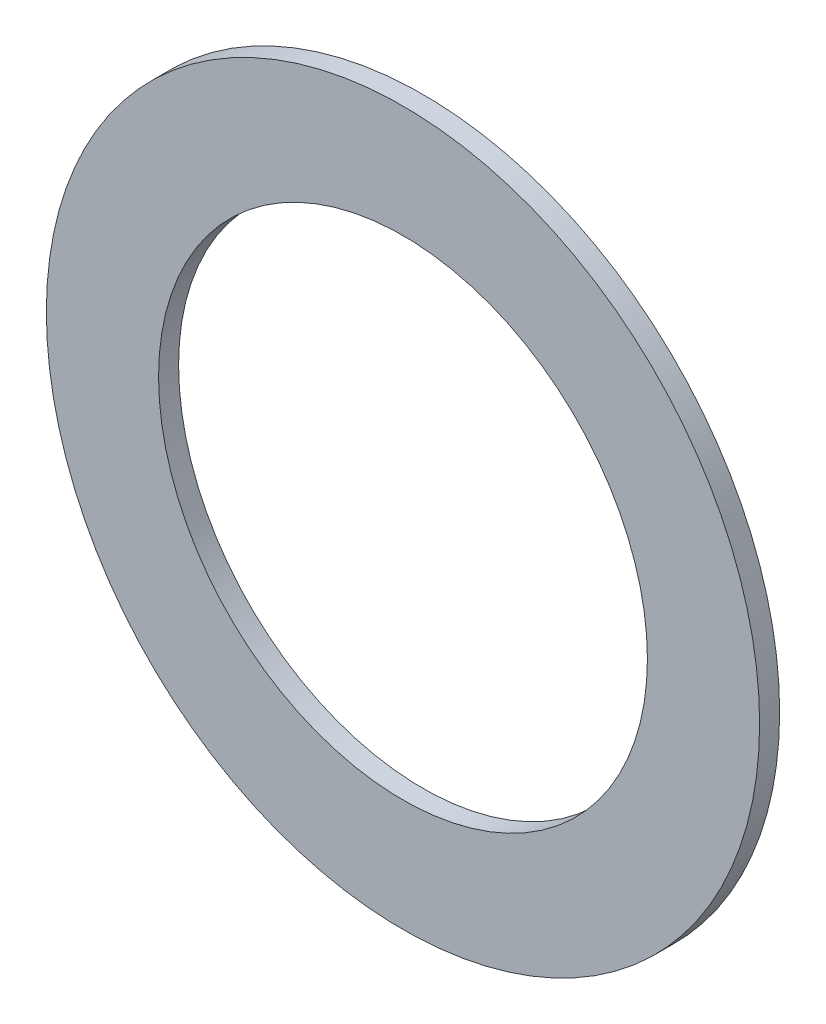
ISO-10303-21;
HEADER;
FILE_DESCRIPTION(('STEP AP214'),'2;1');
FILE_NAME('part.step','',(''),(''),'','','');
FILE_SCHEMA(('AUTOMOTIVE_DESIGN { 1 0 10303 214 1 1 1 1 }'));
ENDSEC;
DATA;
#1=APPLICATION_CONTEXT('core data for automotive mechanical design processes');
#2=APPLICATION_PROTOCOL_DEFINITION('international standard','automotive_design',2000,#1);
#3=PRODUCT_CONTEXT('',#1,'mechanical');
#4=PRODUCT('Part','Part','',(#3));
#5=PRODUCT_RELATED_PRODUCT_CATEGORY('part','',(#4));
#6=PRODUCT_DEFINITION_FORMATION('','',#4);
#7=PRODUCT_DEFINITION_CONTEXT('part definition',#1,'design');
#8=PRODUCT_DEFINITION('design','',#6,#7);
#9=PRODUCT_DEFINITION_SHAPE('','',#8);
#10=(LENGTH_UNIT() NAMED_UNIT(*) SI_UNIT(.MILLI.,.METRE.));
#11=(NAMED_UNIT(*) PLANE_ANGLE_UNIT() SI_UNIT($,.RADIAN.));
#12=(NAMED_UNIT(*) SI_UNIT($,.STERADIAN.) SOLID_ANGLE_UNIT());
#13=UNCERTAINTY_MEASURE_WITH_UNIT(LENGTH_MEASURE(1.E-05),#10,'distance_accuracy_value','');
#14=(GEOMETRIC_REPRESENTATION_CONTEXT(3) GLOBAL_UNCERTAINTY_ASSIGNED_CONTEXT((#13)) GLOBAL_UNIT_ASSIGNED_CONTEXT((#10,
#11,#12)) REPRESENTATION_CONTEXT('',''));
#15=CARTESIAN_POINT('',(0.,0.,0.));
#16=DIRECTION('',(0.,0.,1.));
#17=DIRECTION('',(1.,0.,0.));
#18=AXIS2_PLACEMENT_3D('',#15,#16,#17);
#19=CARTESIAN_POINT('',(0.,0.,0.5));
#20=DIRECTION('',(0.,0.,1.));
#21=DIRECTION('',(1.,0.,0.));
#22=AXIS2_PLACEMENT_3D('',#19,#20,#21);
#23=PLANE('',#22);
#24=CARTESIAN_POINT('',(0.,0.,0.5));
#25=DIRECTION('',(0.,0.,1.));
#26=DIRECTION('',(1.,0.,0.));
#27=AXIS2_PLACEMENT_3D('',#24,#25,#26);
#28=CIRCLE('',#27,8.9);
#29=CARTESIAN_POINT('',(8.9,0.,0.5));
#30=VERTEX_POINT('',#29);
#31=EDGE_CURVE('E10',#30,#30,#28,.T.);
#32=ORIENTED_EDGE('',*,*,#31,.T.);
#33=EDGE_LOOP('',(#32));
#34=FACE_BOUND('',#33,.T.);
#35=CARTESIAN_POINT('',(0.,0.,0.5));
#36=DIRECTION('',(0.,0.,1.));
#37=DIRECTION('',(1.,0.,0.));
#38=AXIS2_PLACEMENT_3D('',#35,#36,#37);
#39=CIRCLE('',#38,6.1);
#40=CARTESIAN_POINT('',(6.1,0.,0.5));
#41=VERTEX_POINT('',#40);
#42=EDGE_CURVE('E359',#41,#41,#39,.T.);
#43=ORIENTED_EDGE('',*,*,#42,.F.);
#44=EDGE_LOOP('',(#43));
#45=FACE_BOUND('',#44,.T.);
#46=ADVANCED_FACE('F348',(#34,#45),#23,.T.);
#47=CARTESIAN_POINT('',(0.,0.,0.));
#48=DIRECTION('',(0.,0.,1.));
#49=DIRECTION('',(1.,0.,0.));
#50=AXIS2_PLACEMENT_3D('',#47,#48,#49);
#51=PLANE('',#50);
#52=CARTESIAN_POINT('',(0.,0.,0.));
#53=DIRECTION('',(0.,0.,1.));
#54=DIRECTION('',(1.,0.,0.));
#55=AXIS2_PLACEMENT_3D('',#52,#53,#54);
#56=CIRCLE('',#55,8.9);
#57=CARTESIAN_POINT('',(8.9,0.,0.));
#58=VERTEX_POINT('',#57);
#59=EDGE_CURVE('E355',#58,#58,#56,.T.);
#60=ORIENTED_EDGE('',*,*,#59,.F.);
#61=EDGE_LOOP('',(#60));
#62=FACE_BOUND('',#61,.T.);
#63=CARTESIAN_POINT('',(0.,0.,0.));
#64=DIRECTION('',(0.,0.,1.));
#65=DIRECTION('',(1.,0.,0.));
#66=AXIS2_PLACEMENT_3D('',#63,#64,#65);
#67=CIRCLE('',#66,6.1);
#68=CARTESIAN_POINT('',(6.1,0.,0.));
#69=VERTEX_POINT('',#68);
#70=EDGE_CURVE('E363',#69,#69,#67,.T.);
#71=ORIENTED_EDGE('',*,*,#70,.T.);
#72=EDGE_LOOP('',(#71));
#73=FACE_BOUND('',#72,.T.);
#74=ADVANCED_FACE('F369',(#62,#73),#51,.F.);
#75=CARTESIAN_POINT('',(0.,0.,0.5));
#76=DIRECTION('',(0.,0.,-1.));
#77=DIRECTION('',(-1.,0.,0.));
#78=AXIS2_PLACEMENT_3D('',#75,#76,#77);
#79=CYLINDRICAL_SURFACE('',#78,8.9);
#80=ORIENTED_EDGE('',*,*,#31,.F.);
#81=EDGE_LOOP('',(#80));
#82=FACE_BOUND('',#81,.T.);
#83=ORIENTED_EDGE('',*,*,#59,.T.);
#84=EDGE_LOOP('',(#83));
#85=FACE_BOUND('',#84,.T.);
#86=ADVANCED_FACE('F350',(#82,#85),#79,.T.);
#87=CARTESIAN_POINT('',(0.,0.,0.5));
#88=DIRECTION('',(0.,0.,-1.));
#89=DIRECTION('',(-1.,0.,0.));
#90=AXIS2_PLACEMENT_3D('',#87,#88,#89);
#91=CYLINDRICAL_SURFACE('',#90,6.1);
#92=ORIENTED_EDGE('',*,*,#42,.T.);
#93=EDGE_LOOP('',(#92));
#94=FACE_BOUND('',#93,.T.);
#95=ORIENTED_EDGE('',*,*,#70,.F.);
#96=EDGE_LOOP('',(#95));
#97=FACE_BOUND('',#96,.T.);
#98=ADVANCED_FACE('F371',(#94,#97),#91,.F.);
#99=CLOSED_SHELL('',(#46,#74,#86,#98));
#100=MANIFOLD_SOLID_BREP('B2',#99);
#101=ADVANCED_BREP_SHAPE_REPRESENTATION('',(#18,#100),#14);
#102=SHAPE_DEFINITION_REPRESENTATION(#9,#101);
ENDSEC;
END-ISO-10303-21;
